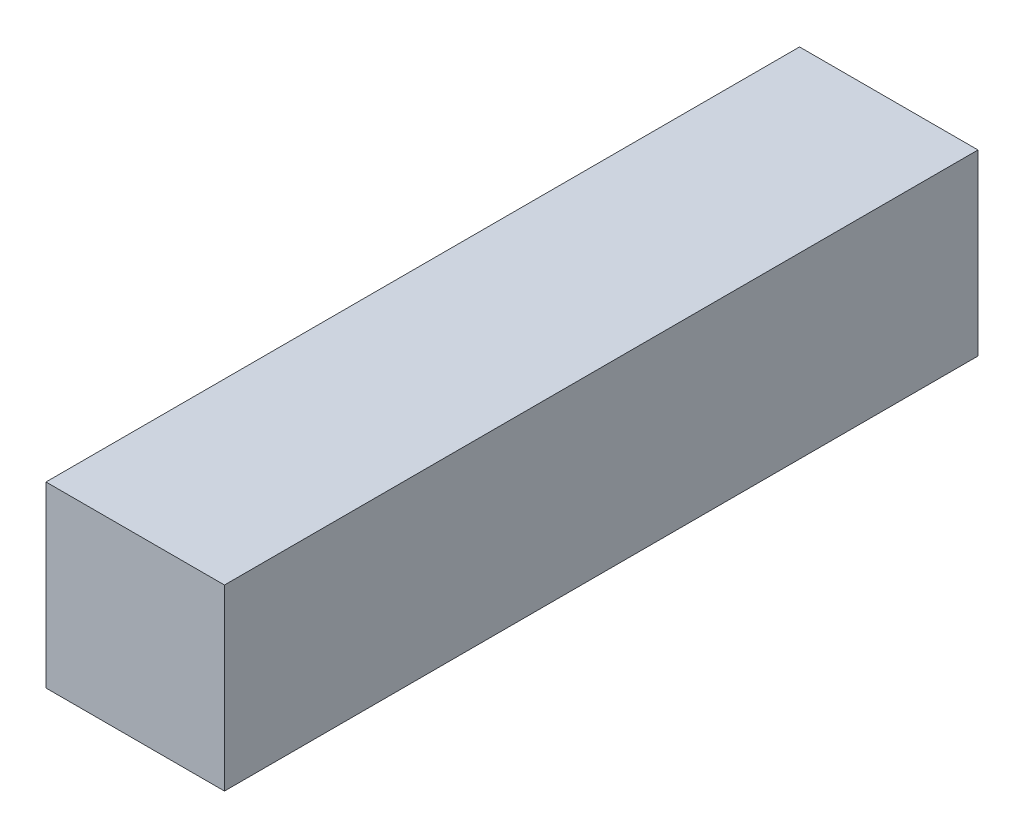
ISO-10303-21;
HEADER;
FILE_DESCRIPTION(('STEP AP214'),'2;1');
FILE_NAME('part.step','',(''),(''),'','','');
FILE_SCHEMA(('AUTOMOTIVE_DESIGN { 1 0 10303 214 1 1 1 1 }'));
ENDSEC;
DATA;
#1=APPLICATION_CONTEXT('core data for automotive mechanical design processes');
#2=APPLICATION_PROTOCOL_DEFINITION('international standard','automotive_design',2000,#1);
#3=PRODUCT_CONTEXT('',#1,'mechanical');
#4=PRODUCT('Part','Part','',(#3));
#5=PRODUCT_RELATED_PRODUCT_CATEGORY('part','',(#4));
#6=PRODUCT_DEFINITION_FORMATION('','',#4);
#7=PRODUCT_DEFINITION_CONTEXT('part definition',#1,'design');
#8=PRODUCT_DEFINITION('design','',#6,#7);
#9=PRODUCT_DEFINITION_SHAPE('','',#8);
#10=(LENGTH_UNIT() NAMED_UNIT(*) SI_UNIT(.MILLI.,.METRE.));
#11=(NAMED_UNIT(*) PLANE_ANGLE_UNIT() SI_UNIT($,.RADIAN.));
#12=(NAMED_UNIT(*) SI_UNIT($,.STERADIAN.) SOLID_ANGLE_UNIT());
#13=UNCERTAINTY_MEASURE_WITH_UNIT(LENGTH_MEASURE(1.E-05),#10,'distance_accuracy_value','');
#14=(GEOMETRIC_REPRESENTATION_CONTEXT(3) GLOBAL_UNCERTAINTY_ASSIGNED_CONTEXT((#13)) GLOBAL_UNIT_ASSIGNED_CONTEXT((#10,
#11,#12)) REPRESENTATION_CONTEXT('',''));
#15=CARTESIAN_POINT('',(0.,0.,0.));
#16=DIRECTION('',(0.,0.,1.));
#17=DIRECTION('',(1.,0.,0.));
#18=AXIS2_PLACEMENT_3D('',#15,#16,#17);
#19=CARTESIAN_POINT('',(3.700838201676,-8.700838201676,1.900028197172));
#20=DIRECTION('',(0.,0.,-1.));
#21=DIRECTION('',(0.,-1.,0.));
#22=AXIS2_PLACEMENT_3D('',#19,#20,#21);
#23=PLANE('',#22);
#24=DIRECTION('',(1.,0.,0.));
#25=VECTOR('',#24,1.);
#26=CARTESIAN_POINT('',(0.700838201676,-11.700838201676,1.900028197172));
#27=LINE('',#26,#25);
#28=CARTESIAN_POINT('',(0.700838201676,-11.700838201676,1.900028197172));
#29=VERTEX_POINT('',#28);
#30=CARTESIAN_POINT('',(1.600838201676,-11.700838201676,1.900028197172));
#31=VERTEX_POINT('',#30);
#32=EDGE_CURVE('E11',#29,#31,#27,.T.);
#33=ORIENTED_EDGE('',*,*,#32,.T.);
#34=DIRECTION('',(0.,1.,0.));
#35=VECTOR('',#34,1.);
#36=CARTESIAN_POINT('',(1.600838201676,-10.800838201676,1.900028197172));
#37=LINE('',#36,#35);
#38=CARTESIAN_POINT('',(1.600838201676,-10.800838201676,1.900028197172));
#39=VERTEX_POINT('',#38);
#40=EDGE_CURVE('E25',#31,#39,#37,.T.);
#41=ORIENTED_EDGE('',*,*,#40,.T.);
#42=DIRECTION('',(-1.,0.,0.));
#43=VECTOR('',#42,1.);
#44=CARTESIAN_POINT('',(0.700838201676,-10.800838201676,1.900028197172));
#45=LINE('',#44,#43);
#46=CARTESIAN_POINT('',(0.700838201676,-10.800838201676,1.900028197172));
#47=VERTEX_POINT('',#46);
#48=EDGE_CURVE('E91',#39,#47,#45,.T.);
#49=ORIENTED_EDGE('',*,*,#48,.T.);
#50=DIRECTION('',(0.,-1.,0.));
#51=VECTOR('',#50,1.);
#52=CARTESIAN_POINT('',(0.700838201676,-10.800838201676,1.900028197172));
#53=LINE('',#52,#51);
#54=EDGE_CURVE('E108',#47,#29,#53,.T.);
#55=ORIENTED_EDGE('',*,*,#54,.T.);
#56=EDGE_LOOP('',(#33,#41,#49,#55));
#57=FACE_BOUND('',#56,.T.);
#58=ADVANCED_FACE('F17',(#57),#23,.F.);
#59=CARTESIAN_POINT('',(3.700838201676,-8.700838201676,-1.899971802828));
#60=DIRECTION('',(0.,0.,-1.));
#61=DIRECTION('',(0.,-1.,0.));
#62=AXIS2_PLACEMENT_3D('',#59,#60,#61);
#63=PLANE('',#62);
#64=DIRECTION('',(1.,0.,0.));
#65=VECTOR('',#64,1.);
#66=CARTESIAN_POINT('',(0.700838201676,-11.700838201676,-1.899971802828));
#67=LINE('',#66,#65);
#68=CARTESIAN_POINT('',(0.700838201676,-11.700838201676,-1.899971802828));
#69=VERTEX_POINT('',#68);
#70=CARTESIAN_POINT('',(1.600838201676,-11.700838201676,-1.899971802828));
#71=VERTEX_POINT('',#70);
#72=EDGE_CURVE('E105',#69,#71,#67,.T.);
#73=ORIENTED_EDGE('',*,*,#72,.F.);
#74=DIRECTION('',(0.,-1.,0.));
#75=VECTOR('',#74,1.);
#76=CARTESIAN_POINT('',(0.700838201676,-10.800838201676,-1.899971802828));
#77=LINE('',#76,#75);
#78=CARTESIAN_POINT('',(0.700838201676,-10.800838201676,-1.899971802828));
#79=VERTEX_POINT('',#78);
#80=EDGE_CURVE('E76',#79,#69,#77,.T.);
#81=ORIENTED_EDGE('',*,*,#80,.F.);
#82=DIRECTION('',(-1.,0.,0.));
#83=VECTOR('',#82,1.);
#84=CARTESIAN_POINT('',(0.700838201676,-10.800838201676,-1.899971802828));
#85=LINE('',#84,#83);
#86=CARTESIAN_POINT('',(1.600838201676,-10.800838201676,-1.899971802828));
#87=VERTEX_POINT('',#86);
#88=EDGE_CURVE('E70',#87,#79,#85,.T.);
#89=ORIENTED_EDGE('',*,*,#88,.F.);
#90=DIRECTION('',(0.,1.,0.));
#91=VECTOR('',#90,1.);
#92=CARTESIAN_POINT('',(1.600838201676,-10.800838201676,-1.899971802828));
#93=LINE('',#92,#91);
#94=EDGE_CURVE('E73',#71,#87,#93,.T.);
#95=ORIENTED_EDGE('',*,*,#94,.F.);
#96=EDGE_LOOP('',(#73,#81,#89,#95));
#97=FACE_BOUND('',#96,.T.);
#98=ADVANCED_FACE('F72',(#97),#63,.T.);
#99=CARTESIAN_POINT('',(1.600838201676,-10.800838201676,-1.899971802828));
#100=DIRECTION('',(1.,0.,0.));
#101=DIRECTION('',(0.,1.,0.));
#102=AXIS2_PLACEMENT_3D('',#99,#100,#101);
#103=PLANE('',#102);
#104=ORIENTED_EDGE('',*,*,#40,.F.);
#105=DIRECTION('',(0.,0.,1.));
#106=VECTOR('',#105,1.);
#107=CARTESIAN_POINT('',(1.600838201676,-11.700838201676,-1.899971802828));
#108=LINE('',#107,#106);
#109=EDGE_CURVE('E86',#71,#31,#108,.T.);
#110=ORIENTED_EDGE('',*,*,#109,.F.);
#111=ORIENTED_EDGE('',*,*,#94,.T.);
#112=DIRECTION('',(0.,0.,1.));
#113=VECTOR('',#112,1.);
#114=CARTESIAN_POINT('',(1.600838201676,-10.800838201676,-1.899971802828));
#115=LINE('',#114,#113);
#116=EDGE_CURVE('E85',#87,#39,#115,.T.);
#117=ORIENTED_EDGE('',*,*,#116,.T.);
#118=EDGE_LOOP('',(#104,#110,#111,#117));
#119=FACE_BOUND('',#118,.T.);
#120=ADVANCED_FACE('F84',(#119),#103,.T.);
#121=CARTESIAN_POINT('',(0.700838201676,-10.800838201676,-1.899971802828));
#122=DIRECTION('',(0.,1.,0.));
#123=DIRECTION('',(1.,0.,0.));
#124=AXIS2_PLACEMENT_3D('',#121,#122,#123);
#125=PLANE('',#124);
#126=ORIENTED_EDGE('',*,*,#48,.F.);
#127=ORIENTED_EDGE('',*,*,#116,.F.);
#128=ORIENTED_EDGE('',*,*,#88,.T.);
#129=DIRECTION('',(0.,0.,1.));
#130=VECTOR('',#129,1.);
#131=CARTESIAN_POINT('',(0.700838201676,-10.800838201676,-1.899971802828));
#132=LINE('',#131,#130);
#133=EDGE_CURVE('E93',#79,#47,#132,.T.);
#134=ORIENTED_EDGE('',*,*,#133,.T.);
#135=EDGE_LOOP('',(#126,#127,#128,#134));
#136=FACE_BOUND('',#135,.T.);
#137=ADVANCED_FACE('F90',(#136),#125,.T.);
#138=CARTESIAN_POINT('',(0.700838201676,-10.800838201676,-1.899971802828));
#139=DIRECTION('',(-1.,0.,0.));
#140=DIRECTION('',(0.,1.,0.));
#141=AXIS2_PLACEMENT_3D('',#138,#139,#140);
#142=PLANE('',#141);
#143=ORIENTED_EDGE('',*,*,#54,.F.);
#144=ORIENTED_EDGE('',*,*,#133,.F.);
#145=ORIENTED_EDGE('',*,*,#80,.T.);
#146=DIRECTION('',(0.,0.,1.));
#147=VECTOR('',#146,1.);
#148=CARTESIAN_POINT('',(0.700838201676,-11.700838201676,-1.899971802828));
#149=LINE('',#148,#147);
#150=EDGE_CURVE('E100',#69,#29,#149,.T.);
#151=ORIENTED_EDGE('',*,*,#150,.T.);
#152=EDGE_LOOP('',(#143,#144,#145,#151));
#153=FACE_BOUND('',#152,.T.);
#154=ADVANCED_FACE('F118',(#153),#142,.T.);
#155=CARTESIAN_POINT('',(0.700838201676,-11.700838201676,-1.899971802828));
#156=DIRECTION('',(0.,-1.,0.));
#157=DIRECTION('',(0.,0.,-1.));
#158=AXIS2_PLACEMENT_3D('',#155,#156,#157);
#159=PLANE('',#158);
#160=ORIENTED_EDGE('',*,*,#32,.F.);
#161=ORIENTED_EDGE('',*,*,#150,.F.);
#162=ORIENTED_EDGE('',*,*,#72,.T.);
#163=ORIENTED_EDGE('',*,*,#109,.T.);
#164=EDGE_LOOP('',(#160,#161,#162,#163));
#165=FACE_BOUND('',#164,.T.);
#166=ADVANCED_FACE('F115',(#165),#159,.T.);
#167=CLOSED_SHELL('',(#58,#98,#120,#137,#154,#166));
#168=MANIFOLD_SOLID_BREP('B1',#167);
#169=ADVANCED_BREP_SHAPE_REPRESENTATION('',(#18,#168),#14);
#170=SHAPE_DEFINITION_REPRESENTATION(#9,#169);
ENDSEC;
END-ISO-10303-21;
